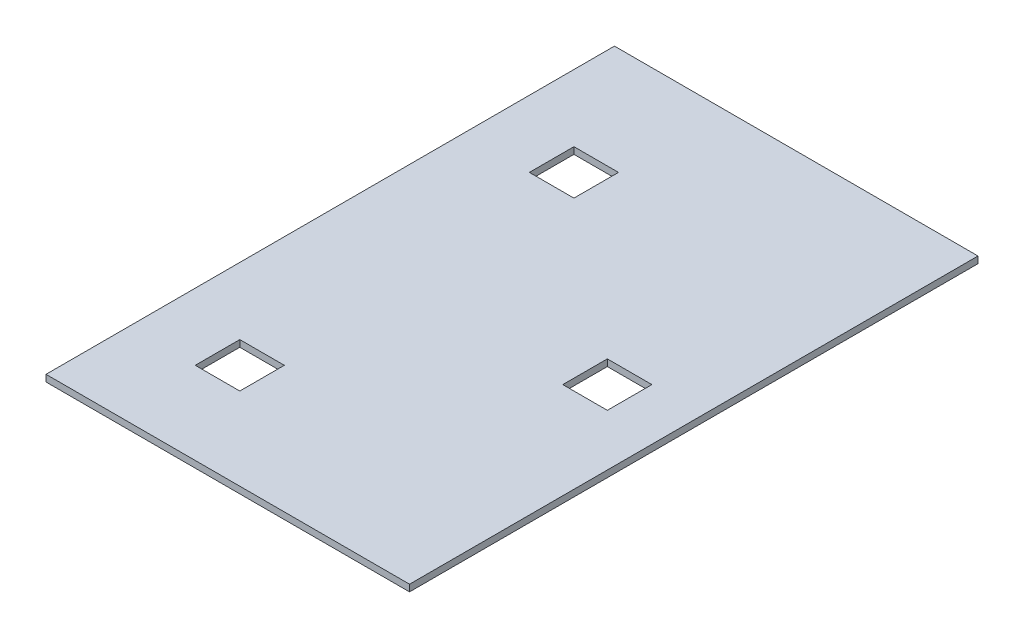
ISO-10303-21;
HEADER;
FILE_DESCRIPTION(('STEP AP214'),'2;1');
FILE_NAME('part.step','',(''),(''),'','','');
FILE_SCHEMA(('AUTOMOTIVE_DESIGN { 1 0 10303 214 1 1 1 1 }'));
ENDSEC;
DATA;
#1=APPLICATION_CONTEXT('core data for automotive mechanical design processes');
#2=APPLICATION_PROTOCOL_DEFINITION('international standard','automotive_design',2000,#1);
#3=PRODUCT_CONTEXT('',#1,'mechanical');
#4=PRODUCT('Part','Part','',(#3));
#5=PRODUCT_RELATED_PRODUCT_CATEGORY('part','',(#4));
#6=PRODUCT_DEFINITION_FORMATION('','',#4);
#7=PRODUCT_DEFINITION_CONTEXT('part definition',#1,'design');
#8=PRODUCT_DEFINITION('design','',#6,#7);
#9=PRODUCT_DEFINITION_SHAPE('','',#8);
#10=(LENGTH_UNIT() NAMED_UNIT(*) SI_UNIT(.MILLI.,.METRE.));
#11=(NAMED_UNIT(*) PLANE_ANGLE_UNIT() SI_UNIT($,.RADIAN.));
#12=(NAMED_UNIT(*) SI_UNIT($,.STERADIAN.) SOLID_ANGLE_UNIT());
#13=UNCERTAINTY_MEASURE_WITH_UNIT(LENGTH_MEASURE(1.E-05),#10,'distance_accuracy_value','');
#14=(GEOMETRIC_REPRESENTATION_CONTEXT(3) GLOBAL_UNCERTAINTY_ASSIGNED_CONTEXT((#13)) GLOBAL_UNIT_ASSIGNED_CONTEXT((#10,
#11,#12)) REPRESENTATION_CONTEXT('',''));
#15=CARTESIAN_POINT('',(0.,0.,0.));
#16=DIRECTION('',(0.,0.,1.));
#17=DIRECTION('',(1.,0.,0.));
#18=AXIS2_PLACEMENT_3D('',#15,#16,#17);
#19=CARTESIAN_POINT('',(163.2,-78.,0.));
#20=DIRECTION('',(1.,0.,0.));
#21=DIRECTION('',(0.,0.,-1.));
#22=AXIS2_PLACEMENT_3D('',#19,#20,#21);
#23=PLANE('',#22);
#24=DIRECTION('',(0.,0.,1.));
#25=VECTOR('',#24,1.);
#26=CARTESIAN_POINT('',(163.2,-81.,0.));
#27=LINE('',#26,#25);
#28=CARTESIAN_POINT('',(163.2,-81.,-19.2));
#29=VERTEX_POINT('',#28);
#30=CARTESIAN_POINT('',(163.2,-81.,236.));
#31=VERTEX_POINT('',#30);
#32=EDGE_CURVE('E346',#29,#31,#27,.T.);
#33=ORIENTED_EDGE('',*,*,#32,.F.);
#34=DIRECTION('',(0.,-1.,0.));
#35=VECTOR('',#34,1.);
#36=CARTESIAN_POINT('',(163.2,-78.,-19.2));
#37=LINE('',#36,#35);
#38=CARTESIAN_POINT('',(163.2,-78.,-19.2));
#39=VERTEX_POINT('',#38);
#40=EDGE_CURVE('E12',#39,#29,#37,.T.);
#41=ORIENTED_EDGE('',*,*,#40,.F.);
#42=DIRECTION('',(0.,0.,1.));
#43=VECTOR('',#42,1.);
#44=CARTESIAN_POINT('',(163.2,-78.,0.));
#45=LINE('',#44,#43);
#46=CARTESIAN_POINT('',(163.2,-78.,236.));
#47=VERTEX_POINT('',#46);
#48=EDGE_CURVE('E178',#39,#47,#45,.T.);
#49=ORIENTED_EDGE('',*,*,#48,.T.);
#50=DIRECTION('',(0.,-1.,0.));
#51=VECTOR('',#50,1.);
#52=CARTESIAN_POINT('',(163.2,-78.,236.));
#53=LINE('',#52,#51);
#54=EDGE_CURVE('E128',#47,#31,#53,.T.);
#55=ORIENTED_EDGE('',*,*,#54,.T.);
#56=EDGE_LOOP('',(#33,#41,#49,#55));
#57=FACE_BOUND('',#56,.T.);
#58=ADVANCED_FACE('F51',(#57),#23,.T.);
#59=CARTESIAN_POINT('',(0.,-78.,-19.2));
#60=DIRECTION('',(0.,0.,1.));
#61=DIRECTION('',(1.,0.,0.));
#62=AXIS2_PLACEMENT_3D('',#59,#60,#61);
#63=PLANE('',#62);
#64=DIRECTION('',(-1.,0.,0.));
#65=VECTOR('',#64,1.);
#66=CARTESIAN_POINT('',(0.,-81.,-19.2));
#67=LINE('',#66,#65);
#68=CARTESIAN_POINT('',(0.,-81.,-19.2));
#69=VERTEX_POINT('',#68);
#70=EDGE_CURVE('E185',#29,#69,#67,.T.);
#71=ORIENTED_EDGE('',*,*,#70,.T.);
#72=DIRECTION('',(0.,-1.,0.));
#73=VECTOR('',#72,1.);
#74=CARTESIAN_POINT('',(0.,-78.,-19.2));
#75=LINE('',#74,#73);
#76=CARTESIAN_POINT('',(0.,-78.,-19.2));
#77=VERTEX_POINT('',#76);
#78=EDGE_CURVE('E61',#77,#69,#75,.T.);
#79=ORIENTED_EDGE('',*,*,#78,.F.);
#80=DIRECTION('',(-1.,0.,0.));
#81=VECTOR('',#80,1.);
#82=CARTESIAN_POINT('',(0.,-78.,-19.2));
#83=LINE('',#82,#81);
#84=EDGE_CURVE('E173',#39,#77,#83,.T.);
#85=ORIENTED_EDGE('',*,*,#84,.F.);
#86=ORIENTED_EDGE('',*,*,#40,.T.);
#87=EDGE_LOOP('',(#71,#79,#85,#86));
#88=FACE_BOUND('',#87,.T.);
#89=ADVANCED_FACE('F183',(#88),#63,.F.);
#90=CARTESIAN_POINT('',(0.,-78.,0.));
#91=DIRECTION('',(-1.,0.,0.));
#92=DIRECTION('',(0.,0.,1.));
#93=AXIS2_PLACEMENT_3D('',#90,#91,#92);
#94=PLANE('',#93);
#95=DIRECTION('',(0.,0.,-1.));
#96=VECTOR('',#95,1.);
#97=CARTESIAN_POINT('',(0.,-81.,0.));
#98=LINE('',#97,#96);
#99=CARTESIAN_POINT('',(0.,-81.,236.));
#100=VERTEX_POINT('',#99);
#101=EDGE_CURVE('E273',#100,#69,#98,.T.);
#102=ORIENTED_EDGE('',*,*,#101,.F.);
#103=DIRECTION('',(0.,-1.,0.));
#104=VECTOR('',#103,1.);
#105=CARTESIAN_POINT('',(0.,-78.,236.));
#106=LINE('',#105,#104);
#107=CARTESIAN_POINT('',(0.,-78.,236.));
#108=VERTEX_POINT('',#107);
#109=EDGE_CURVE('E121',#108,#100,#106,.T.);
#110=ORIENTED_EDGE('',*,*,#109,.F.);
#111=DIRECTION('',(0.,0.,-1.));
#112=VECTOR('',#111,1.);
#113=CARTESIAN_POINT('',(0.,-78.,0.));
#114=LINE('',#113,#112);
#115=EDGE_CURVE('E177',#108,#77,#114,.T.);
#116=ORIENTED_EDGE('',*,*,#115,.T.);
#117=ORIENTED_EDGE('',*,*,#78,.T.);
#118=EDGE_LOOP('',(#102,#110,#116,#117));
#119=FACE_BOUND('',#118,.T.);
#120=ADVANCED_FACE('F190',(#119),#94,.T.);
#121=CARTESIAN_POINT('',(0.,-78.,199.));
#122=DIRECTION('',(0.,0.,-1.));
#123=DIRECTION('',(-1.,0.,0.));
#124=AXIS2_PLACEMENT_3D('',#121,#122,#123);
#125=PLANE('',#124);
#126=DIRECTION('',(1.,0.,0.));
#127=VECTOR('',#126,1.);
#128=CARTESIAN_POINT('',(0.,-81.,199.));
#129=LINE('',#128,#127);
#130=CARTESIAN_POINT('',(30.,-81.,199.));
#131=VERTEX_POINT('',#130);
#132=CARTESIAN_POINT('',(50.,-81.,199.));
#133=VERTEX_POINT('',#132);
#134=EDGE_CURVE('E334',#131,#133,#129,.T.);
#135=ORIENTED_EDGE('',*,*,#134,.F.);
#136=DIRECTION('',(0.,-1.,0.));
#137=VECTOR('',#136,1.);
#138=CARTESIAN_POINT('',(30.,-78.,199.));
#139=LINE('',#138,#137);
#140=CARTESIAN_POINT('',(30.,-78.,199.));
#141=VERTEX_POINT('',#140);
#142=EDGE_CURVE('E280',#141,#131,#139,.T.);
#143=ORIENTED_EDGE('',*,*,#142,.F.);
#144=DIRECTION('',(1.,0.,0.));
#145=VECTOR('',#144,1.);
#146=CARTESIAN_POINT('',(0.,-78.,199.));
#147=LINE('',#146,#145);
#148=CARTESIAN_POINT('',(50.,-78.,199.));
#149=VERTEX_POINT('',#148);
#150=EDGE_CURVE('E225',#141,#149,#147,.T.);
#151=ORIENTED_EDGE('',*,*,#150,.T.);
#152=DIRECTION('',(0.,-1.,0.));
#153=VECTOR('',#152,1.);
#154=CARTESIAN_POINT('',(50.,-78.,199.));
#155=LINE('',#154,#153);
#156=EDGE_CURVE('E282',#149,#133,#155,.T.);
#157=ORIENTED_EDGE('',*,*,#156,.T.);
#158=EDGE_LOOP('',(#135,#143,#151,#157));
#159=FACE_BOUND('',#158,.T.);
#160=ADVANCED_FACE('F371',(#159),#125,.T.);
#161=CARTESIAN_POINT('',(30.,-78.,0.));
#162=DIRECTION('',(1.,0.,0.));
#163=DIRECTION('',(0.,0.,-1.));
#164=AXIS2_PLACEMENT_3D('',#161,#162,#163);
#165=PLANE('',#164);
#166=DIRECTION('',(0.,0.,1.));
#167=VECTOR('',#166,1.);
#168=CARTESIAN_POINT('',(30.,-81.,0.));
#169=LINE('',#168,#167);
#170=CARTESIAN_POINT('',(30.,-81.,179.));
#171=VERTEX_POINT('',#170);
#172=EDGE_CURVE('E337',#171,#131,#169,.T.);
#173=ORIENTED_EDGE('',*,*,#172,.F.);
#174=DIRECTION('',(0.,-1.,0.));
#175=VECTOR('',#174,1.);
#176=CARTESIAN_POINT('',(30.,-78.,179.));
#177=LINE('',#176,#175);
#178=CARTESIAN_POINT('',(30.,-78.,179.));
#179=VERTEX_POINT('',#178);
#180=EDGE_CURVE('E287',#179,#171,#177,.T.);
#181=ORIENTED_EDGE('',*,*,#180,.F.);
#182=DIRECTION('',(0.,0.,1.));
#183=VECTOR('',#182,1.);
#184=CARTESIAN_POINT('',(30.,-78.,0.));
#185=LINE('',#184,#183);
#186=EDGE_CURVE('E217',#179,#141,#185,.T.);
#187=ORIENTED_EDGE('',*,*,#186,.T.);
#188=ORIENTED_EDGE('',*,*,#142,.T.);
#189=EDGE_LOOP('',(#173,#181,#187,#188));
#190=FACE_BOUND('',#189,.T.);
#191=ADVANCED_FACE('F367',(#190),#165,.T.);
#192=CARTESIAN_POINT('',(0.,-78.,179.));
#193=DIRECTION('',(0.,0.,1.));
#194=DIRECTION('',(1.,0.,0.));
#195=AXIS2_PLACEMENT_3D('',#192,#193,#194);
#196=PLANE('',#195);
#197=DIRECTION('',(-1.,0.,0.));
#198=VECTOR('',#197,1.);
#199=CARTESIAN_POINT('',(0.,-81.,179.));
#200=LINE('',#199,#198);
#201=CARTESIAN_POINT('',(50.,-81.,179.));
#202=VERTEX_POINT('',#201);
#203=EDGE_CURVE('E340',#202,#171,#200,.T.);
#204=ORIENTED_EDGE('',*,*,#203,.F.);
#205=DIRECTION('',(0.,-1.,0.));
#206=VECTOR('',#205,1.);
#207=CARTESIAN_POINT('',(50.,-78.,179.));
#208=LINE('',#207,#206);
#209=CARTESIAN_POINT('',(50.,-78.,179.));
#210=VERTEX_POINT('',#209);
#211=EDGE_CURVE('E284',#210,#202,#208,.T.);
#212=ORIENTED_EDGE('',*,*,#211,.F.);
#213=DIRECTION('',(-1.,0.,0.));
#214=VECTOR('',#213,1.);
#215=CARTESIAN_POINT('',(0.,-78.,179.));
#216=LINE('',#215,#214);
#217=EDGE_CURVE('E212',#210,#179,#216,.T.);
#218=ORIENTED_EDGE('',*,*,#217,.T.);
#219=ORIENTED_EDGE('',*,*,#180,.T.);
#220=EDGE_LOOP('',(#204,#212,#218,#219));
#221=FACE_BOUND('',#220,.T.);
#222=ADVANCED_FACE('F363',(#221),#196,.T.);
#223=CARTESIAN_POINT('',(0.,-78.,49.));
#224=DIRECTION('',(0.,0.,-1.));
#225=DIRECTION('',(-1.,0.,0.));
#226=AXIS2_PLACEMENT_3D('',#223,#224,#225);
#227=PLANE('',#226);
#228=DIRECTION('',(1.,0.,0.));
#229=VECTOR('',#228,1.);
#230=CARTESIAN_POINT('',(0.,-81.,49.));
#231=LINE('',#230,#229);
#232=CARTESIAN_POINT('',(30.,-81.,49.));
#233=VERTEX_POINT('',#232);
#234=CARTESIAN_POINT('',(50.,-81.,49.));
#235=VERTEX_POINT('',#234);
#236=EDGE_CURVE('E322',#233,#235,#231,.T.);
#237=ORIENTED_EDGE('',*,*,#236,.F.);
#238=DIRECTION('',(0.,-1.,0.));
#239=VECTOR('',#238,1.);
#240=CARTESIAN_POINT('',(30.,-78.,49.));
#241=LINE('',#240,#239);
#242=CARTESIAN_POINT('',(30.,-78.,49.));
#243=VERTEX_POINT('',#242);
#244=EDGE_CURVE('E285',#243,#233,#241,.T.);
#245=ORIENTED_EDGE('',*,*,#244,.F.);
#246=DIRECTION('',(1.,0.,0.));
#247=VECTOR('',#246,1.);
#248=CARTESIAN_POINT('',(0.,-78.,49.));
#249=LINE('',#248,#247);
#250=CARTESIAN_POINT('',(50.,-78.,49.));
#251=VERTEX_POINT('',#250);
#252=EDGE_CURVE('E247',#243,#251,#249,.T.);
#253=ORIENTED_EDGE('',*,*,#252,.T.);
#254=DIRECTION('',(0.,-1.,0.));
#255=VECTOR('',#254,1.);
#256=CARTESIAN_POINT('',(50.,-78.,49.));
#257=LINE('',#256,#255);
#258=EDGE_CURVE('E290',#251,#235,#257,.T.);
#259=ORIENTED_EDGE('',*,*,#258,.T.);
#260=EDGE_LOOP('',(#237,#245,#253,#259));
#261=FACE_BOUND('',#260,.T.);
#262=ADVANCED_FACE('F366',(#261),#227,.T.);
#263=CARTESIAN_POINT('',(30.,-78.,0.));
#264=DIRECTION('',(1.,0.,0.));
#265=DIRECTION('',(0.,0.,-1.));
#266=AXIS2_PLACEMENT_3D('',#263,#264,#265);
#267=PLANE('',#266);
#268=DIRECTION('',(0.,0.,1.));
#269=VECTOR('',#268,1.);
#270=CARTESIAN_POINT('',(30.,-81.,0.));
#271=LINE('',#270,#269);
#272=CARTESIAN_POINT('',(30.,-81.,29.));
#273=VERTEX_POINT('',#272);
#274=EDGE_CURVE('E325',#273,#233,#271,.T.);
#275=ORIENTED_EDGE('',*,*,#274,.F.);
#276=DIRECTION('',(0.,-1.,0.));
#277=VECTOR('',#276,1.);
#278=CARTESIAN_POINT('',(30.,-78.,29.));
#279=LINE('',#278,#277);
#280=CARTESIAN_POINT('',(30.,-78.,29.));
#281=VERTEX_POINT('',#280);
#282=EDGE_CURVE('E294',#281,#273,#279,.T.);
#283=ORIENTED_EDGE('',*,*,#282,.F.);
#284=DIRECTION('',(0.,0.,1.));
#285=VECTOR('',#284,1.);
#286=CARTESIAN_POINT('',(30.,-78.,0.));
#287=LINE('',#286,#285);
#288=EDGE_CURVE('E239',#281,#243,#287,.T.);
#289=ORIENTED_EDGE('',*,*,#288,.T.);
#290=ORIENTED_EDGE('',*,*,#244,.T.);
#291=EDGE_LOOP('',(#275,#283,#289,#290));
#292=FACE_BOUND('',#291,.T.);
#293=ADVANCED_FACE('F383',(#292),#267,.T.);
#294=CARTESIAN_POINT('',(0.,-78.,29.));
#295=DIRECTION('',(0.,0.,1.));
#296=DIRECTION('',(1.,0.,0.));
#297=AXIS2_PLACEMENT_3D('',#294,#295,#296);
#298=PLANE('',#297);
#299=DIRECTION('',(-1.,0.,0.));
#300=VECTOR('',#299,1.);
#301=CARTESIAN_POINT('',(0.,-81.,29.));
#302=LINE('',#301,#300);
#303=CARTESIAN_POINT('',(50.,-81.,29.));
#304=VERTEX_POINT('',#303);
#305=EDGE_CURVE('E328',#304,#273,#302,.T.);
#306=ORIENTED_EDGE('',*,*,#305,.F.);
#307=DIRECTION('',(0.,-1.,0.));
#308=VECTOR('',#307,1.);
#309=CARTESIAN_POINT('',(50.,-78.,29.));
#310=LINE('',#309,#308);
#311=CARTESIAN_POINT('',(50.,-78.,29.));
#312=VERTEX_POINT('',#311);
#313=EDGE_CURVE('E292',#312,#304,#310,.T.);
#314=ORIENTED_EDGE('',*,*,#313,.F.);
#315=DIRECTION('',(-1.,0.,0.));
#316=VECTOR('',#315,1.);
#317=CARTESIAN_POINT('',(0.,-78.,29.));
#318=LINE('',#317,#316);
#319=EDGE_CURVE('E234',#312,#281,#318,.T.);
#320=ORIENTED_EDGE('',*,*,#319,.T.);
#321=ORIENTED_EDGE('',*,*,#282,.T.);
#322=EDGE_LOOP('',(#306,#314,#320,#321));
#323=FACE_BOUND('',#322,.T.);
#324=ADVANCED_FACE('F380',(#323),#298,.T.);
#325=CARTESIAN_POINT('',(140.,-78.,-1.94289029309402E-13));
#326=DIRECTION('',(-1.,0.,0.));
#327=DIRECTION('',(0.,0.,1.));
#328=AXIS2_PLACEMENT_3D('',#325,#326,#327);
#329=PLANE('',#328);
#330=DIRECTION('',(0.,0.,-1.));
#331=VECTOR('',#330,1.);
#332=CARTESIAN_POINT('',(140.,-81.,-1.94289029309402E-13));
#333=LINE('',#332,#331);
#334=CARTESIAN_POINT('',(140.,-81.,124.));
#335=VERTEX_POINT('',#334);
#336=CARTESIAN_POINT('',(140.,-81.,104.));
#337=VERTEX_POINT('',#336);
#338=EDGE_CURVE('E310',#335,#337,#333,.T.);
#339=ORIENTED_EDGE('',*,*,#338,.F.);
#340=DIRECTION('',(0.,-1.,0.));
#341=VECTOR('',#340,1.);
#342=CARTESIAN_POINT('',(140.,-78.,124.));
#343=LINE('',#342,#341);
#344=CARTESIAN_POINT('',(140.,-78.,124.));
#345=VERTEX_POINT('',#344);
#346=EDGE_CURVE('E55',#345,#335,#343,.T.);
#347=ORIENTED_EDGE('',*,*,#346,.F.);
#348=DIRECTION('',(0.,0.,-1.));
#349=VECTOR('',#348,1.);
#350=CARTESIAN_POINT('',(140.,-78.,-1.94289029309402E-13));
#351=LINE('',#350,#349);
#352=CARTESIAN_POINT('',(140.,-78.,104.));
#353=VERTEX_POINT('',#352);
#354=EDGE_CURVE('E266',#345,#353,#351,.T.);
#355=ORIENTED_EDGE('',*,*,#354,.T.);
#356=DIRECTION('',(0.,-1.,0.));
#357=VECTOR('',#356,1.);
#358=CARTESIAN_POINT('',(140.,-78.,104.));
#359=LINE('',#358,#357);
#360=EDGE_CURVE('E194',#353,#337,#359,.T.);
#361=ORIENTED_EDGE('',*,*,#360,.T.);
#362=EDGE_LOOP('',(#339,#347,#355,#361));
#363=FACE_BOUND('',#362,.T.);
#364=ADVANCED_FACE('F53',(#363),#329,.T.);
#365=CARTESIAN_POINT('',(0.,-78.,124.));
#366=DIRECTION('',(0.,0.,-1.));
#367=DIRECTION('',(-1.,0.,0.));
#368=AXIS2_PLACEMENT_3D('',#365,#366,#367);
#369=PLANE('',#368);
#370=DIRECTION('',(1.,0.,0.));
#371=VECTOR('',#370,1.);
#372=CARTESIAN_POINT('',(0.,-81.,124.));
#373=LINE('',#372,#371);
#374=CARTESIAN_POINT('',(120.,-81.,124.));
#375=VERTEX_POINT('',#374);
#376=EDGE_CURVE('E306',#375,#335,#373,.T.);
#377=ORIENTED_EDGE('',*,*,#376,.F.);
#378=DIRECTION('',(0.,-1.,0.));
#379=VECTOR('',#378,1.);
#380=CARTESIAN_POINT('',(120.,-78.,124.));
#381=LINE('',#380,#379);
#382=CARTESIAN_POINT('',(120.,-78.,124.));
#383=VERTEX_POINT('',#382);
#384=EDGE_CURVE('E299',#383,#375,#381,.T.);
#385=ORIENTED_EDGE('',*,*,#384,.F.);
#386=DIRECTION('',(1.,0.,0.));
#387=VECTOR('',#386,1.);
#388=CARTESIAN_POINT('',(0.,-78.,124.));
#389=LINE('',#388,#387);
#390=EDGE_CURVE('E261',#383,#345,#389,.T.);
#391=ORIENTED_EDGE('',*,*,#390,.T.);
#392=ORIENTED_EDGE('',*,*,#346,.T.);
#393=EDGE_LOOP('',(#377,#385,#391,#392));
#394=FACE_BOUND('',#393,.T.);
#395=ADVANCED_FACE('F304',(#394),#369,.T.);
#396=CARTESIAN_POINT('',(120.,-78.,0.));
#397=DIRECTION('',(1.,0.,0.));
#398=DIRECTION('',(0.,0.,-1.));
#399=AXIS2_PLACEMENT_3D('',#396,#397,#398);
#400=PLANE('',#399);
#401=DIRECTION('',(0.,0.,1.));
#402=VECTOR('',#401,1.);
#403=CARTESIAN_POINT('',(120.,-81.,0.));
#404=LINE('',#403,#402);
#405=CARTESIAN_POINT('',(120.,-81.,104.));
#406=VERTEX_POINT('',#405);
#407=EDGE_CURVE('E316',#406,#375,#404,.T.);
#408=ORIENTED_EDGE('',*,*,#407,.F.);
#409=DIRECTION('',(0.,-1.,0.));
#410=VECTOR('',#409,1.);
#411=CARTESIAN_POINT('',(120.,-78.,104.));
#412=LINE('',#411,#410);
#413=CARTESIAN_POINT('',(120.,-78.,104.));
#414=VERTEX_POINT('',#413);
#415=EDGE_CURVE('E298',#414,#406,#412,.T.);
#416=ORIENTED_EDGE('',*,*,#415,.F.);
#417=DIRECTION('',(0.,0.,1.));
#418=VECTOR('',#417,1.);
#419=CARTESIAN_POINT('',(120.,-78.,0.));
#420=LINE('',#419,#418);
#421=EDGE_CURVE('E256',#414,#383,#420,.T.);
#422=ORIENTED_EDGE('',*,*,#421,.T.);
#423=ORIENTED_EDGE('',*,*,#384,.T.);
#424=EDGE_LOOP('',(#408,#416,#422,#423));
#425=FACE_BOUND('',#424,.T.);
#426=ADVANCED_FACE('F361',(#425),#400,.T.);
#427=CARTESIAN_POINT('',(50.,-78.,0.));
#428=DIRECTION('',(-1.,0.,0.));
#429=DIRECTION('',(0.,0.,1.));
#430=AXIS2_PLACEMENT_3D('',#427,#428,#429);
#431=PLANE('',#430);
#432=DIRECTION('',(0.,0.,-1.));
#433=VECTOR('',#432,1.);
#434=CARTESIAN_POINT('',(50.,-81.,0.));
#435=LINE('',#434,#433);
#436=EDGE_CURVE('E343',#133,#202,#435,.T.);
#437=ORIENTED_EDGE('',*,*,#436,.F.);
#438=ORIENTED_EDGE('',*,*,#156,.F.);
#439=DIRECTION('',(0.,0.,-1.));
#440=VECTOR('',#439,1.);
#441=CARTESIAN_POINT('',(50.,-78.,0.));
#442=LINE('',#441,#440);
#443=EDGE_CURVE('E207',#149,#210,#442,.T.);
#444=ORIENTED_EDGE('',*,*,#443,.T.);
#445=ORIENTED_EDGE('',*,*,#211,.T.);
#446=EDGE_LOOP('',(#437,#438,#444,#445));
#447=FACE_BOUND('',#446,.T.);
#448=ADVANCED_FACE('F357',(#447),#431,.T.);
#449=CARTESIAN_POINT('',(50.,-78.,0.));
#450=DIRECTION('',(-1.,0.,0.));
#451=DIRECTION('',(0.,0.,1.));
#452=AXIS2_PLACEMENT_3D('',#449,#450,#451);
#453=PLANE('',#452);
#454=DIRECTION('',(0.,0.,-1.));
#455=VECTOR('',#454,1.);
#456=CARTESIAN_POINT('',(50.,-81.,0.));
#457=LINE('',#456,#455);
#458=EDGE_CURVE('E331',#235,#304,#457,.T.);
#459=ORIENTED_EDGE('',*,*,#458,.F.);
#460=ORIENTED_EDGE('',*,*,#258,.F.);
#461=DIRECTION('',(0.,0.,-1.));
#462=VECTOR('',#461,1.);
#463=CARTESIAN_POINT('',(50.,-78.,0.));
#464=LINE('',#463,#462);
#465=EDGE_CURVE('E229',#251,#312,#464,.T.);
#466=ORIENTED_EDGE('',*,*,#465,.T.);
#467=ORIENTED_EDGE('',*,*,#313,.T.);
#468=EDGE_LOOP('',(#459,#460,#466,#467));
#469=FACE_BOUND('',#468,.T.);
#470=ADVANCED_FACE('F360',(#469),#453,.T.);
#471=CARTESIAN_POINT('',(0.,-78.,104.));
#472=DIRECTION('',(0.,0.,1.));
#473=DIRECTION('',(1.,0.,0.));
#474=AXIS2_PLACEMENT_3D('',#471,#472,#473);
#475=PLANE('',#474);
#476=DIRECTION('',(-1.,0.,0.));
#477=VECTOR('',#476,1.);
#478=CARTESIAN_POINT('',(0.,-81.,104.));
#479=LINE('',#478,#477);
#480=EDGE_CURVE('E318',#337,#406,#479,.T.);
#481=ORIENTED_EDGE('',*,*,#480,.F.);
#482=ORIENTED_EDGE('',*,*,#360,.F.);
#483=DIRECTION('',(-1.,0.,0.));
#484=VECTOR('',#483,1.);
#485=CARTESIAN_POINT('',(0.,-78.,104.));
#486=LINE('',#485,#484);
#487=EDGE_CURVE('E251',#353,#414,#486,.T.);
#488=ORIENTED_EDGE('',*,*,#487,.T.);
#489=ORIENTED_EDGE('',*,*,#415,.T.);
#490=EDGE_LOOP('',(#481,#482,#488,#489));
#491=FACE_BOUND('',#490,.T.);
#492=ADVANCED_FACE('F378',(#491),#475,.T.);
#493=CARTESIAN_POINT('',(0.,-78.,236.));
#494=DIRECTION('',(0.,0.,-1.));
#495=DIRECTION('',(-1.,0.,0.));
#496=AXIS2_PLACEMENT_3D('',#493,#494,#495);
#497=PLANE('',#496);
#498=DIRECTION('',(1.,0.,0.));
#499=VECTOR('',#498,1.);
#500=CARTESIAN_POINT('',(0.,-81.,236.));
#501=LINE('',#500,#499);
#502=EDGE_CURVE('E269',#100,#31,#501,.T.);
#503=ORIENTED_EDGE('',*,*,#502,.T.);
#504=ORIENTED_EDGE('',*,*,#54,.F.);
#505=DIRECTION('',(1.,0.,0.));
#506=VECTOR('',#505,1.);
#507=CARTESIAN_POINT('',(0.,-78.,236.));
#508=LINE('',#507,#506);
#509=EDGE_CURVE('E70',#108,#47,#508,.T.);
#510=ORIENTED_EDGE('',*,*,#509,.F.);
#511=ORIENTED_EDGE('',*,*,#109,.T.);
#512=EDGE_LOOP('',(#503,#504,#510,#511));
#513=FACE_BOUND('',#512,.T.);
#514=ADVANCED_FACE('F393',(#513),#497,.F.);
#515=CARTESIAN_POINT('',(0.,-78.,0.));
#516=DIRECTION('',(0.,1.,0.));
#517=DIRECTION('',(0.,0.,1.));
#518=AXIS2_PLACEMENT_3D('',#515,#516,#517);
#519=PLANE('',#518);
#520=ORIENTED_EDGE('',*,*,#354,.F.);
#521=ORIENTED_EDGE('',*,*,#390,.F.);
#522=ORIENTED_EDGE('',*,*,#421,.F.);
#523=ORIENTED_EDGE('',*,*,#487,.F.);
#524=EDGE_LOOP('',(#520,#521,#522,#523));
#525=FACE_BOUND('',#524,.T.);
#526=ORIENTED_EDGE('',*,*,#252,.F.);
#527=ORIENTED_EDGE('',*,*,#288,.F.);
#528=ORIENTED_EDGE('',*,*,#319,.F.);
#529=ORIENTED_EDGE('',*,*,#465,.F.);
#530=EDGE_LOOP('',(#526,#527,#528,#529));
#531=FACE_BOUND('',#530,.T.);
#532=ORIENTED_EDGE('',*,*,#150,.F.);
#533=ORIENTED_EDGE('',*,*,#186,.F.);
#534=ORIENTED_EDGE('',*,*,#217,.F.);
#535=ORIENTED_EDGE('',*,*,#443,.F.);
#536=EDGE_LOOP('',(#532,#533,#534,#535));
#537=FACE_BOUND('',#536,.T.);
#538=ORIENTED_EDGE('',*,*,#48,.F.);
#539=ORIENTED_EDGE('',*,*,#84,.T.);
#540=ORIENTED_EDGE('',*,*,#115,.F.);
#541=ORIENTED_EDGE('',*,*,#509,.T.);
#542=EDGE_LOOP('',(#538,#539,#540,#541));
#543=FACE_BOUND('',#542,.T.);
#544=ADVANCED_FACE('F175',(#525,#531,#537,#543),#519,.T.);
#545=CARTESIAN_POINT('',(0.,-81.,0.));
#546=DIRECTION('',(0.,1.,0.));
#547=DIRECTION('',(0.,0.,1.));
#548=AXIS2_PLACEMENT_3D('',#545,#546,#547);
#549=PLANE('',#548);
#550=ORIENTED_EDGE('',*,*,#338,.T.);
#551=ORIENTED_EDGE('',*,*,#480,.T.);
#552=ORIENTED_EDGE('',*,*,#407,.T.);
#553=ORIENTED_EDGE('',*,*,#376,.T.);
#554=EDGE_LOOP('',(#550,#551,#552,#553));
#555=FACE_BOUND('',#554,.T.);
#556=ORIENTED_EDGE('',*,*,#236,.T.);
#557=ORIENTED_EDGE('',*,*,#458,.T.);
#558=ORIENTED_EDGE('',*,*,#305,.T.);
#559=ORIENTED_EDGE('',*,*,#274,.T.);
#560=EDGE_LOOP('',(#556,#557,#558,#559));
#561=FACE_BOUND('',#560,.T.);
#562=ORIENTED_EDGE('',*,*,#134,.T.);
#563=ORIENTED_EDGE('',*,*,#436,.T.);
#564=ORIENTED_EDGE('',*,*,#203,.T.);
#565=ORIENTED_EDGE('',*,*,#172,.T.);
#566=EDGE_LOOP('',(#562,#563,#564,#565));
#567=FACE_BOUND('',#566,.T.);
#568=ORIENTED_EDGE('',*,*,#32,.T.);
#569=ORIENTED_EDGE('',*,*,#502,.F.);
#570=ORIENTED_EDGE('',*,*,#101,.T.);
#571=ORIENTED_EDGE('',*,*,#70,.F.);
#572=EDGE_LOOP('',(#568,#569,#570,#571));
#573=FACE_BOUND('',#572,.T.);
#574=ADVANCED_FACE('F314',(#555,#561,#567,#573),#549,.F.);
#575=CLOSED_SHELL('',(#58,#89,#120,#160,#191,#222,#262,#293,#324,#364,#395,#426,#448,#470,#492,
#514,#544,#574));
#576=MANIFOLD_SOLID_BREP('B2',#575);
#577=ADVANCED_BREP_SHAPE_REPRESENTATION('',(#18,#576),#14);
#578=SHAPE_DEFINITION_REPRESENTATION(#9,#577);
ENDSEC;
END-ISO-10303-21;
